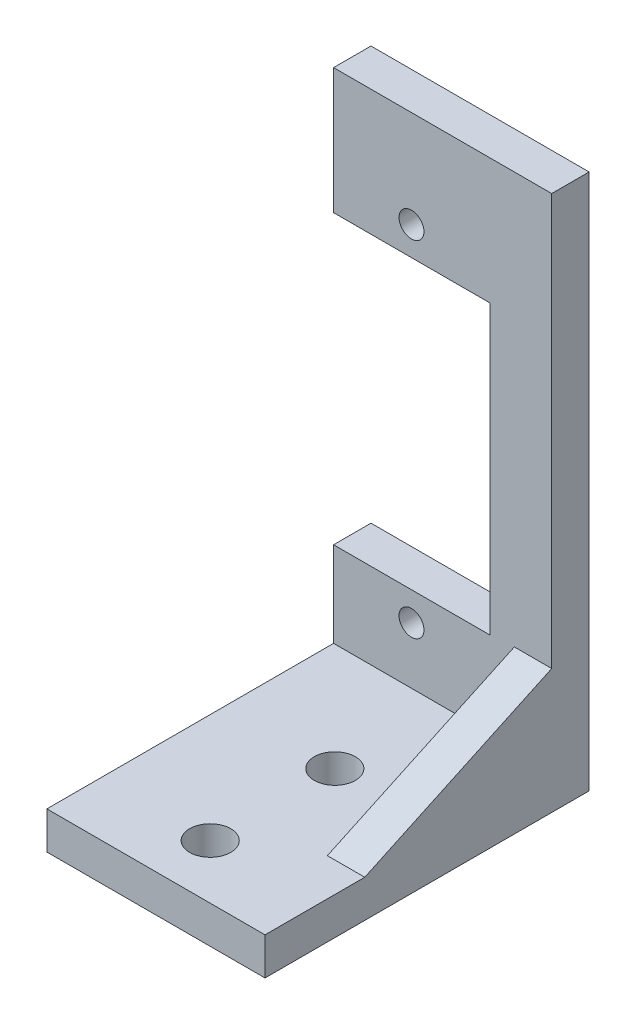
ISO-10303-21;
HEADER;
FILE_DESCRIPTION(('STEP AP214'),'2;1');
FILE_NAME('part.step','',(''),(''),'','','');
FILE_SCHEMA(('AUTOMOTIVE_DESIGN { 1 0 10303 214 1 1 1 1 }'));
ENDSEC;
DATA;
#1=APPLICATION_CONTEXT('core data for automotive mechanical design processes');
#2=APPLICATION_PROTOCOL_DEFINITION('international standard','automotive_design',2000,#1);
#3=PRODUCT_CONTEXT('',#1,'mechanical');
#4=PRODUCT('Part','Part','',(#3));
#5=PRODUCT_RELATED_PRODUCT_CATEGORY('part','',(#4));
#6=PRODUCT_DEFINITION_FORMATION('','',#4);
#7=PRODUCT_DEFINITION_CONTEXT('part definition',#1,'design');
#8=PRODUCT_DEFINITION('design','',#6,#7);
#9=PRODUCT_DEFINITION_SHAPE('','',#8);
#10=(LENGTH_UNIT() NAMED_UNIT(*) SI_UNIT(.MILLI.,.METRE.));
#11=(NAMED_UNIT(*) PLANE_ANGLE_UNIT() SI_UNIT($,.RADIAN.));
#12=(NAMED_UNIT(*) SI_UNIT($,.STERADIAN.) SOLID_ANGLE_UNIT());
#13=UNCERTAINTY_MEASURE_WITH_UNIT(LENGTH_MEASURE(1.E-05),#10,'distance_accuracy_value','');
#14=(GEOMETRIC_REPRESENTATION_CONTEXT(3) GLOBAL_UNCERTAINTY_ASSIGNED_CONTEXT((#13)) GLOBAL_UNIT_ASSIGNED_CONTEXT((#10,
#11,#12)) REPRESENTATION_CONTEXT('',''));
#15=CARTESIAN_POINT('',(0.,0.,0.));
#16=DIRECTION('',(0.,0.,1.));
#17=DIRECTION('',(1.,0.,0.));
#18=AXIS2_PLACEMENT_3D('',#15,#16,#17);
#19=CARTESIAN_POINT('',(-8.75,3.,11.5));
#20=DIRECTION('',(1.,0.,0.));
#21=DIRECTION('',(0.,0.,-1.));
#22=AXIS2_PLACEMENT_3D('',#19,#20,#21);
#23=PLANE('',#22);
#24=DIRECTION('',(0.,-1.,0.));
#25=VECTOR('',#24,1.);
#26=CARTESIAN_POINT('',(-8.75,43.,-11.5));
#27=LINE('',#26,#25);
#28=CARTESIAN_POINT('',(-8.75,9.85,-11.5));
#29=VERTEX_POINT('',#28);
#30=CARTESIAN_POINT('',(-8.75,3.,-11.5));
#31=VERTEX_POINT('',#30);
#32=EDGE_CURVE('E243',#29,#31,#27,.T.);
#33=ORIENTED_EDGE('',*,*,#32,.F.);
#34=DIRECTION('',(0.,0.,-1.));
#35=VECTOR('',#34,1.);
#36=CARTESIAN_POINT('',(-8.75,9.85,14.7626617082123));
#37=LINE('',#36,#35);
#38=CARTESIAN_POINT('',(-8.75,9.85,-14.5));
#39=VERTEX_POINT('',#38);
#40=EDGE_CURVE('E190',#29,#39,#37,.T.);
#41=ORIENTED_EDGE('',*,*,#40,.T.);
#42=DIRECTION('',(0.,-1.,0.));
#43=VECTOR('',#42,1.);
#44=CARTESIAN_POINT('',(-8.75,43.,-14.5));
#45=LINE('',#44,#43);
#46=CARTESIAN_POINT('',(-8.75,0.,-14.5));
#47=VERTEX_POINT('',#46);
#48=EDGE_CURVE('E228',#39,#47,#45,.T.);
#49=ORIENTED_EDGE('',*,*,#48,.T.);
#50=DIRECTION('',(0.,0.,1.));
#51=VECTOR('',#50,1.);
#52=CARTESIAN_POINT('',(-8.75,0.,11.5));
#53=LINE('',#52,#51);
#54=CARTESIAN_POINT('',(-8.75,0.,11.5));
#55=VERTEX_POINT('',#54);
#56=EDGE_CURVE('E261',#47,#55,#53,.T.);
#57=ORIENTED_EDGE('',*,*,#56,.T.);
#58=DIRECTION('',(0.,-1.,0.));
#59=VECTOR('',#58,1.);
#60=CARTESIAN_POINT('',(-8.75,3.,11.5));
#61=LINE('',#60,#59);
#62=CARTESIAN_POINT('',(-8.75,3.,11.5));
#63=VERTEX_POINT('',#62);
#64=EDGE_CURVE('E11',#63,#55,#61,.T.);
#65=ORIENTED_EDGE('',*,*,#64,.F.);
#66=DIRECTION('',(0.,0.,1.));
#67=VECTOR('',#66,1.);
#68=CARTESIAN_POINT('',(-8.75,3.,11.5));
#69=LINE('',#68,#67);
#70=EDGE_CURVE('E265',#31,#63,#69,.T.);
#71=ORIENTED_EDGE('',*,*,#70,.F.);
#72=EDGE_LOOP('',(#33,#41,#49,#57,#65,#71));
#73=FACE_BOUND('',#72,.T.);
#74=ADVANCED_FACE('F39',(#73),#23,.F.);
#75=CARTESIAN_POINT('',(0.,3.,0.));
#76=DIRECTION('',(0.,1.,0.));
#77=DIRECTION('',(0.,0.,1.));
#78=AXIS2_PLACEMENT_3D('',#75,#76,#77);
#79=PLANE('',#78);
#80=DIRECTION('',(1.,0.,0.));
#81=VECTOR('',#80,1.);
#82=CARTESIAN_POINT('',(5.75,3.,3.5));
#83=LINE('',#82,#81);
#84=CARTESIAN_POINT('',(5.75,3.,3.5));
#85=VERTEX_POINT('',#84);
#86=CARTESIAN_POINT('',(8.75,3.,3.5));
#87=VERTEX_POINT('',#86);
#88=EDGE_CURVE('E148',#85,#87,#83,.T.);
#89=ORIENTED_EDGE('',*,*,#88,.F.);
#90=DIRECTION('',(0.,0.,-1.));
#91=VECTOR('',#90,1.);
#92=CARTESIAN_POINT('',(5.75,3.,-11.5));
#93=LINE('',#92,#91);
#94=CARTESIAN_POINT('',(5.75,3.,-11.5));
#95=VERTEX_POINT('',#94);
#96=EDGE_CURVE('E149',#85,#95,#93,.T.);
#97=ORIENTED_EDGE('',*,*,#96,.T.);
#98=DIRECTION('',(-1.,0.,0.));
#99=VECTOR('',#98,1.);
#100=CARTESIAN_POINT('',(8.75,3.,-11.5));
#101=LINE('',#100,#99);
#102=EDGE_CURVE('E64',#95,#31,#101,.T.);
#103=ORIENTED_EDGE('',*,*,#102,.T.);
#104=ORIENTED_EDGE('',*,*,#70,.T.);
#105=DIRECTION('',(1.,0.,0.));
#106=VECTOR('',#105,1.);
#107=CARTESIAN_POINT('',(8.75,3.,11.5));
#108=LINE('',#107,#106);
#109=CARTESIAN_POINT('',(8.75,3.,11.5));
#110=VERTEX_POINT('',#109);
#111=EDGE_CURVE('E81',#63,#110,#108,.T.);
#112=ORIENTED_EDGE('',*,*,#111,.T.);
#113=DIRECTION('',(0.,0.,-1.));
#114=VECTOR('',#113,1.);
#115=CARTESIAN_POINT('',(8.75,3.,11.5));
#116=LINE('',#115,#114);
#117=EDGE_CURVE('E271',#110,#87,#116,.T.);
#118=ORIENTED_EDGE('',*,*,#117,.T.);
#119=EDGE_LOOP('',(#89,#97,#103,#104,#112,#118));
#120=FACE_BOUND('',#119,.T.);
#121=CARTESIAN_POINT('',(0.,3.,-2.85));
#122=DIRECTION('',(0.,1.,0.));
#123=DIRECTION('',(0.,0.,1.));
#124=AXIS2_PLACEMENT_3D('',#121,#122,#123);
#125=CIRCLE('',#124,1.65);
#126=CARTESIAN_POINT('',(0.,3.,-1.2));
#127=VERTEX_POINT('',#126);
#128=EDGE_CURVE('E257',#127,#127,#125,.T.);
#129=ORIENTED_EDGE('',*,*,#128,.F.);
#130=EDGE_LOOP('',(#129));
#131=FACE_BOUND('',#130,.T.);
#132=CARTESIAN_POINT('',(0.,3.,7.15));
#133=DIRECTION('',(0.,1.,0.));
#134=DIRECTION('',(0.,0.,1.));
#135=AXIS2_PLACEMENT_3D('',#132,#133,#134);
#136=CIRCLE('',#135,1.65);
#137=CARTESIAN_POINT('',(0.,3.,8.8));
#138=VERTEX_POINT('',#137);
#139=EDGE_CURVE('E249',#138,#138,#136,.T.);
#140=ORIENTED_EDGE('',*,*,#139,.F.);
#141=EDGE_LOOP('',(#140));
#142=FACE_BOUND('',#141,.T.);
#143=ADVANCED_FACE('F331',(#120,#131,#142),#79,.T.);
#144=CARTESIAN_POINT('',(0.,0.,0.));
#145=DIRECTION('',(0.,1.,0.));
#146=DIRECTION('',(0.,0.,1.));
#147=AXIS2_PLACEMENT_3D('',#144,#145,#146);
#148=PLANE('',#147);
#149=ORIENTED_EDGE('',*,*,#56,.F.);
#150=DIRECTION('',(-1.,0.,0.));
#151=VECTOR('',#150,1.);
#152=CARTESIAN_POINT('',(-8.75,0.,-14.5));
#153=LINE('',#152,#151);
#154=CARTESIAN_POINT('',(8.75,0.,-14.5));
#155=VERTEX_POINT('',#154);
#156=EDGE_CURVE('E177',#155,#47,#153,.T.);
#157=ORIENTED_EDGE('',*,*,#156,.F.);
#158=DIRECTION('',(0.,0.,-1.));
#159=VECTOR('',#158,1.);
#160=CARTESIAN_POINT('',(8.75,0.,11.5));
#161=LINE('',#160,#159);
#162=CARTESIAN_POINT('',(8.75,0.,11.5));
#163=VERTEX_POINT('',#162);
#164=EDGE_CURVE('E268',#163,#155,#161,.T.);
#165=ORIENTED_EDGE('',*,*,#164,.F.);
#166=DIRECTION('',(1.,0.,0.));
#167=VECTOR('',#166,1.);
#168=CARTESIAN_POINT('',(8.75,0.,11.5));
#169=LINE('',#168,#167);
#170=EDGE_CURVE('E78',#55,#163,#169,.T.);
#171=ORIENTED_EDGE('',*,*,#170,.F.);
#172=EDGE_LOOP('',(#149,#157,#165,#171));
#173=FACE_BOUND('',#172,.T.);
#174=CARTESIAN_POINT('',(0.,0.,-2.85));
#175=DIRECTION('',(0.,1.,0.));
#176=DIRECTION('',(0.,0.,1.));
#177=AXIS2_PLACEMENT_3D('',#174,#175,#176);
#178=CIRCLE('',#177,1.65);
#179=CARTESIAN_POINT('',(0.,0.,-1.2));
#180=VERTEX_POINT('',#179);
#181=EDGE_CURVE('E253',#180,#180,#178,.T.);
#182=ORIENTED_EDGE('',*,*,#181,.T.);
#183=EDGE_LOOP('',(#182));
#184=FACE_BOUND('',#183,.T.);
#185=CARTESIAN_POINT('',(0.,0.,7.15));
#186=DIRECTION('',(0.,1.,0.));
#187=DIRECTION('',(0.,0.,1.));
#188=AXIS2_PLACEMENT_3D('',#185,#186,#187);
#189=CIRCLE('',#188,1.65);
#190=CARTESIAN_POINT('',(0.,0.,8.8));
#191=VERTEX_POINT('',#190);
#192=EDGE_CURVE('E248',#191,#191,#189,.T.);
#193=ORIENTED_EDGE('',*,*,#192,.T.);
#194=EDGE_LOOP('',(#193));
#195=FACE_BOUND('',#194,.T.);
#196=ADVANCED_FACE('F292',(#173,#184,#195),#148,.F.);
#197=CARTESIAN_POINT('',(-8.75,43.,-14.5));
#198=VERTEX_POINT('',#197);
#199=CARTESIAN_POINT('',(-8.75,32.92,-14.5));
#200=VERTEX_POINT('',#199);
#201=EDGE_CURVE('E232',#198,#200,#45,.T.);
#202=ORIENTED_EDGE('',*,*,#201,.T.);
#203=DIRECTION('',(0.,0.,-1.));
#204=VECTOR('',#203,1.);
#205=CARTESIAN_POINT('',(-8.75,32.92,14.7626617082123));
#206=LINE('',#205,#204);
#207=CARTESIAN_POINT('',(-8.75,32.92,-11.5));
#208=VERTEX_POINT('',#207);
#209=EDGE_CURVE('E55',#208,#200,#206,.T.);
#210=ORIENTED_EDGE('',*,*,#209,.F.);
#211=CARTESIAN_POINT('',(-8.75,43.,-11.5));
#212=VERTEX_POINT('',#211);
#213=EDGE_CURVE('E244',#212,#208,#27,.T.);
#214=ORIENTED_EDGE('',*,*,#213,.F.);
#215=DIRECTION('',(0.,0.,1.));
#216=VECTOR('',#215,1.);
#217=CARTESIAN_POINT('',(-8.75,43.,-11.5));
#218=LINE('',#217,#216);
#219=EDGE_CURVE('E215',#198,#212,#218,.T.);
#220=ORIENTED_EDGE('',*,*,#219,.F.);
#221=EDGE_LOOP('',(#202,#210,#214,#220));
#222=FACE_BOUND('',#221,.T.);
#223=ADVANCED_FACE('F41',(#222),#23,.F.);
#224=CARTESIAN_POINT('',(8.75,3.,11.5));
#225=DIRECTION('',(0.,0.,-1.));
#226=DIRECTION('',(-1.,0.,0.));
#227=AXIS2_PLACEMENT_3D('',#224,#225,#226);
#228=PLANE('',#227);
#229=ORIENTED_EDGE('',*,*,#170,.T.);
#230=DIRECTION('',(0.,-1.,0.));
#231=VECTOR('',#230,1.);
#232=CARTESIAN_POINT('',(8.75,3.,11.5));
#233=LINE('',#232,#231);
#234=EDGE_CURVE('E48',#110,#163,#233,.T.);
#235=ORIENTED_EDGE('',*,*,#234,.F.);
#236=ORIENTED_EDGE('',*,*,#111,.F.);
#237=ORIENTED_EDGE('',*,*,#64,.T.);
#238=EDGE_LOOP('',(#229,#235,#236,#237));
#239=FACE_BOUND('',#238,.T.);
#240=ADVANCED_FACE('F322',(#239),#228,.F.);
#241=CARTESIAN_POINT('',(8.75,3.,11.5));
#242=DIRECTION('',(-1.,0.,0.));
#243=DIRECTION('',(0.,0.,1.));
#244=AXIS2_PLACEMENT_3D('',#241,#242,#243);
#245=PLANE('',#244);
#246=ORIENTED_EDGE('',*,*,#164,.T.);
#247=DIRECTION('',(0.,-1.,0.));
#248=VECTOR('',#247,1.);
#249=CARTESIAN_POINT('',(8.75,43.,-14.5));
#250=LINE('',#249,#248);
#251=CARTESIAN_POINT('',(8.75,43.,-14.5));
#252=VERTEX_POINT('',#251);
#253=EDGE_CURVE('E236',#252,#155,#250,.T.);
#254=ORIENTED_EDGE('',*,*,#253,.F.);
#255=DIRECTION('',(0.,0.,-1.));
#256=VECTOR('',#255,1.);
#257=CARTESIAN_POINT('',(8.75,43.,-11.5));
#258=LINE('',#257,#256);
#259=CARTESIAN_POINT('',(8.75,43.,-11.5));
#260=VERTEX_POINT('',#259);
#261=EDGE_CURVE('E222',#260,#252,#258,.T.);
#262=ORIENTED_EDGE('',*,*,#261,.F.);
#263=DIRECTION('',(0.,-1.,0.));
#264=VECTOR('',#263,1.);
#265=CARTESIAN_POINT('',(8.75,43.,-11.5));
#266=LINE('',#265,#264);
#267=CARTESIAN_POINT('',(8.75,10.,-11.5));
#268=VERTEX_POINT('',#267);
#269=EDGE_CURVE('E240',#260,#268,#266,.T.);
#270=ORIENTED_EDGE('',*,*,#269,.T.);
#271=DIRECTION('',(0.,-0.422885465331124,0.906183139995265));
#272=VECTOR('',#271,1.);
#273=CARTESIAN_POINT('',(8.75,3.,3.5));
#274=LINE('',#273,#272);
#275=EDGE_CURVE('E142',#268,#87,#274,.T.);
#276=ORIENTED_EDGE('',*,*,#275,.T.);
#277=ORIENTED_EDGE('',*,*,#117,.F.);
#278=ORIENTED_EDGE('',*,*,#234,.T.);
#279=EDGE_LOOP('',(#246,#254,#262,#270,#276,#277,#278));
#280=FACE_BOUND('',#279,.T.);
#281=ADVANCED_FACE('F287',(#280),#245,.F.);
#282=CARTESIAN_POINT('',(0.,3.,-2.85));
#283=DIRECTION('',(0.,-1.,0.));
#284=DIRECTION('',(0.,0.,-1.));
#285=AXIS2_PLACEMENT_3D('',#282,#283,#284);
#286=CYLINDRICAL_SURFACE('',#285,1.65);
#287=ORIENTED_EDGE('',*,*,#128,.T.);
#288=EDGE_LOOP('',(#287));
#289=FACE_BOUND('',#288,.T.);
#290=ORIENTED_EDGE('',*,*,#181,.F.);
#291=EDGE_LOOP('',(#290));
#292=FACE_BOUND('',#291,.T.);
#293=ADVANCED_FACE('F328',(#289,#292),#286,.F.);
#294=CARTESIAN_POINT('',(0.,3.,7.15));
#295=DIRECTION('',(0.,-1.,0.));
#296=DIRECTION('',(0.,0.,-1.));
#297=AXIS2_PLACEMENT_3D('',#294,#295,#296);
#298=CYLINDRICAL_SURFACE('',#297,1.65);
#299=ORIENTED_EDGE('',*,*,#139,.T.);
#300=EDGE_LOOP('',(#299));
#301=FACE_BOUND('',#300,.T.);
#302=ORIENTED_EDGE('',*,*,#192,.F.);
#303=EDGE_LOOP('',(#302));
#304=FACE_BOUND('',#303,.T.);
#305=ADVANCED_FACE('F344',(#301,#304),#298,.F.);
#306=CARTESIAN_POINT('',(-8.75,43.,-11.5));
#307=DIRECTION('',(0.,0.,-1.));
#308=DIRECTION('',(-1.,0.,0.));
#309=AXIS2_PLACEMENT_3D('',#306,#307,#308);
#310=PLANE('',#309);
#311=CARTESIAN_POINT('',(-2.5,7.55,-11.5));
#312=DIRECTION('',(0.,0.,-1.));
#313=DIRECTION('',(-1.,0.,0.));
#314=AXIS2_PLACEMENT_3D('',#311,#312,#313);
#315=CIRCLE('',#314,1.);
#316=CARTESIAN_POINT('',(-3.5,7.55,-11.5));
#317=VERTEX_POINT('',#316);
#318=EDGE_CURVE('E172',#317,#317,#315,.F.);
#319=ORIENTED_EDGE('',*,*,#318,.F.);
#320=EDGE_LOOP('',(#319));
#321=FACE_BOUND('',#320,.T.);
#322=CARTESIAN_POINT('',(-2.5,35.22,-11.5));
#323=DIRECTION('',(0.,0.,-1.));
#324=DIRECTION('',(-1.,0.,0.));
#325=AXIS2_PLACEMENT_3D('',#322,#323,#324);
#326=CIRCLE('',#325,1.);
#327=CARTESIAN_POINT('',(-3.5,35.22,-11.5));
#328=VERTEX_POINT('',#327);
#329=EDGE_CURVE('E173',#328,#328,#326,.F.);
#330=ORIENTED_EDGE('',*,*,#329,.F.);
#331=EDGE_LOOP('',(#330));
#332=FACE_BOUND('',#331,.T.);
#333=DIRECTION('',(0.,1.,0.));
#334=VECTOR('',#333,1.);
#335=CARTESIAN_POINT('',(5.75,10.,-11.5));
#336=LINE('',#335,#334);
#337=CARTESIAN_POINT('',(5.75,10.,-11.5));
#338=VERTEX_POINT('',#337);
#339=EDGE_CURVE('E153',#95,#338,#336,.T.);
#340=ORIENTED_EDGE('',*,*,#339,.T.);
#341=DIRECTION('',(1.,0.,0.));
#342=VECTOR('',#341,1.);
#343=CARTESIAN_POINT('',(5.75,10.,-11.5));
#344=LINE('',#343,#342);
#345=EDGE_CURVE('E136',#338,#268,#344,.T.);
#346=ORIENTED_EDGE('',*,*,#345,.T.);
#347=ORIENTED_EDGE('',*,*,#269,.F.);
#348=DIRECTION('',(1.,0.,0.));
#349=VECTOR('',#348,1.);
#350=CARTESIAN_POINT('',(-8.75,43.,-11.5));
#351=LINE('',#350,#349);
#352=EDGE_CURVE('E219',#212,#260,#351,.T.);
#353=ORIENTED_EDGE('',*,*,#352,.F.);
#354=ORIENTED_EDGE('',*,*,#213,.T.);
#355=DIRECTION('',(-1.,0.,0.));
#356=VECTOR('',#355,1.);
#357=CARTESIAN_POINT('',(-8.75,32.92,-11.5));
#358=LINE('',#357,#356);
#359=CARTESIAN_POINT('',(3.8,32.92,-11.5));
#360=VERTEX_POINT('',#359);
#361=EDGE_CURVE('E182',#360,#208,#358,.T.);
#362=ORIENTED_EDGE('',*,*,#361,.F.);
#363=DIRECTION('',(0.,1.,0.));
#364=VECTOR('',#363,1.);
#365=CARTESIAN_POINT('',(3.8,9.85,-11.5));
#366=LINE('',#365,#364);
#367=CARTESIAN_POINT('',(3.8,9.85,-11.5));
#368=VERTEX_POINT('',#367);
#369=EDGE_CURVE('E186',#368,#360,#366,.T.);
#370=ORIENTED_EDGE('',*,*,#369,.F.);
#371=DIRECTION('',(1.,0.,0.));
#372=VECTOR('',#371,1.);
#373=CARTESIAN_POINT('',(-8.75,9.85,-11.5));
#374=LINE('',#373,#372);
#375=EDGE_CURVE('E189',#29,#368,#374,.T.);
#376=ORIENTED_EDGE('',*,*,#375,.F.);
#377=ORIENTED_EDGE('',*,*,#32,.T.);
#378=ORIENTED_EDGE('',*,*,#102,.F.);
#379=EDGE_LOOP('',(#340,#346,#347,#353,#354,#362,#370,#376,#377,#378));
#380=FACE_BOUND('',#379,.T.);
#381=ADVANCED_FACE('F157',(#321,#332,#380),#310,.F.);
#382=CARTESIAN_POINT('',(-8.75,43.,-14.5));
#383=DIRECTION('',(0.,0.,1.));
#384=DIRECTION('',(1.,0.,0.));
#385=AXIS2_PLACEMENT_3D('',#382,#383,#384);
#386=PLANE('',#385);
#387=CARTESIAN_POINT('',(-2.5,7.55,-14.5));
#388=DIRECTION('',(0.,0.,-1.));
#389=DIRECTION('',(-1.,0.,0.));
#390=AXIS2_PLACEMENT_3D('',#387,#388,#389);
#391=CIRCLE('',#390,1.);
#392=CARTESIAN_POINT('',(-3.5,7.55,-14.5));
#393=VERTEX_POINT('',#392);
#394=EDGE_CURVE('E168',#393,#393,#391,.T.);
#395=ORIENTED_EDGE('',*,*,#394,.F.);
#396=EDGE_LOOP('',(#395));
#397=FACE_BOUND('',#396,.T.);
#398=CARTESIAN_POINT('',(-2.5,35.22,-14.5));
#399=DIRECTION('',(0.,0.,-1.));
#400=DIRECTION('',(-1.,0.,0.));
#401=AXIS2_PLACEMENT_3D('',#398,#399,#400);
#402=CIRCLE('',#401,1.);
#403=CARTESIAN_POINT('',(-3.5,35.22,-14.5));
#404=VERTEX_POINT('',#403);
#405=EDGE_CURVE('E178',#404,#404,#402,.T.);
#406=ORIENTED_EDGE('',*,*,#405,.F.);
#407=EDGE_LOOP('',(#406));
#408=FACE_BOUND('',#407,.T.);
#409=ORIENTED_EDGE('',*,*,#48,.F.);
#410=DIRECTION('',(-1.,0.,0.));
#411=VECTOR('',#410,1.);
#412=CARTESIAN_POINT('',(-8.75,9.85,-14.5));
#413=LINE('',#412,#411);
#414=CARTESIAN_POINT('',(3.8,9.85,-14.5));
#415=VERTEX_POINT('',#414);
#416=EDGE_CURVE('E199',#415,#39,#413,.T.);
#417=ORIENTED_EDGE('',*,*,#416,.F.);
#418=DIRECTION('',(0.,-1.,0.));
#419=VECTOR('',#418,1.);
#420=CARTESIAN_POINT('',(3.8,9.85,-14.5));
#421=LINE('',#420,#419);
#422=CARTESIAN_POINT('',(3.8,32.92,-14.5));
#423=VERTEX_POINT('',#422);
#424=EDGE_CURVE('E195',#423,#415,#421,.T.);
#425=ORIENTED_EDGE('',*,*,#424,.F.);
#426=DIRECTION('',(1.,0.,0.));
#427=VECTOR('',#426,1.);
#428=CARTESIAN_POINT('',(-8.75,32.92,-14.5));
#429=LINE('',#428,#427);
#430=EDGE_CURVE('E166',#200,#423,#429,.T.);
#431=ORIENTED_EDGE('',*,*,#430,.F.);
#432=ORIENTED_EDGE('',*,*,#201,.F.);
#433=DIRECTION('',(-1.,0.,0.));
#434=VECTOR('',#433,1.);
#435=CARTESIAN_POINT('',(-8.75,43.,-14.5));
#436=LINE('',#435,#434);
#437=EDGE_CURVE('E225',#252,#198,#436,.T.);
#438=ORIENTED_EDGE('',*,*,#437,.F.);
#439=ORIENTED_EDGE('',*,*,#253,.T.);
#440=ORIENTED_EDGE('',*,*,#156,.T.);
#441=EDGE_LOOP('',(#409,#417,#425,#431,#432,#438,#439,#440));
#442=FACE_BOUND('',#441,.T.);
#443=ADVANCED_FACE('F296',(#397,#408,#442),#386,.F.);
#444=CARTESIAN_POINT('',(0.,43.,0.));
#445=DIRECTION('',(0.,-1.,0.));
#446=DIRECTION('',(0.,0.,-1.));
#447=AXIS2_PLACEMENT_3D('',#444,#445,#446);
#448=PLANE('',#447);
#449=ORIENTED_EDGE('',*,*,#219,.T.);
#450=ORIENTED_EDGE('',*,*,#352,.T.);
#451=ORIENTED_EDGE('',*,*,#261,.T.);
#452=ORIENTED_EDGE('',*,*,#437,.T.);
#453=EDGE_LOOP('',(#449,#450,#451,#452));
#454=FACE_BOUND('',#453,.T.);
#455=ADVANCED_FACE('F302',(#454),#448,.F.);
#456=CARTESIAN_POINT('',(-8.75,9.85,14.7626617082123));
#457=DIRECTION('',(0.,-1.,0.));
#458=DIRECTION('',(1.,0.,0.));
#459=AXIS2_PLACEMENT_3D('',#456,#457,#458);
#460=PLANE('',#459);
#461=ORIENTED_EDGE('',*,*,#375,.T.);
#462=DIRECTION('',(0.,0.,-1.));
#463=VECTOR('',#462,1.);
#464=CARTESIAN_POINT('',(3.8,9.85,14.7626617082123));
#465=LINE('',#464,#463);
#466=EDGE_CURVE('E205',#368,#415,#465,.T.);
#467=ORIENTED_EDGE('',*,*,#466,.T.);
#468=ORIENTED_EDGE('',*,*,#416,.T.);
#469=ORIENTED_EDGE('',*,*,#40,.F.);
#470=EDGE_LOOP('',(#461,#467,#468,#469));
#471=FACE_BOUND('',#470,.T.);
#472=ADVANCED_FACE('F357',(#471),#460,.F.);
#473=CARTESIAN_POINT('',(3.8,9.85,14.7626617082123));
#474=DIRECTION('',(1.,0.,0.));
#475=DIRECTION('',(0.,0.,-1.));
#476=AXIS2_PLACEMENT_3D('',#473,#474,#475);
#477=PLANE('',#476);
#478=ORIENTED_EDGE('',*,*,#369,.T.);
#479=DIRECTION('',(0.,0.,-1.));
#480=VECTOR('',#479,1.);
#481=CARTESIAN_POINT('',(3.8,32.92,14.7626617082123));
#482=LINE('',#481,#480);
#483=EDGE_CURVE('E208',#360,#423,#482,.T.);
#484=ORIENTED_EDGE('',*,*,#483,.T.);
#485=ORIENTED_EDGE('',*,*,#424,.T.);
#486=ORIENTED_EDGE('',*,*,#466,.F.);
#487=EDGE_LOOP('',(#478,#484,#485,#486));
#488=FACE_BOUND('',#487,.T.);
#489=ADVANCED_FACE('F312',(#488),#477,.F.);
#490=CARTESIAN_POINT('',(-8.75,32.92,14.7626617082123));
#491=DIRECTION('',(0.,1.,0.));
#492=DIRECTION('',(0.,0.,1.));
#493=AXIS2_PLACEMENT_3D('',#490,#491,#492);
#494=PLANE('',#493);
#495=ORIENTED_EDGE('',*,*,#361,.T.);
#496=ORIENTED_EDGE('',*,*,#209,.T.);
#497=ORIENTED_EDGE('',*,*,#430,.T.);
#498=ORIENTED_EDGE('',*,*,#483,.F.);
#499=EDGE_LOOP('',(#495,#496,#497,#498));
#500=FACE_BOUND('',#499,.T.);
#501=ADVANCED_FACE('F310',(#500),#494,.F.);
#502=CARTESIAN_POINT('',(-2.5,35.22,14.7626617082123));
#503=DIRECTION('',(0.,0.,-1.));
#504=DIRECTION('',(-1.,0.,0.));
#505=AXIS2_PLACEMENT_3D('',#502,#503,#504);
#506=CYLINDRICAL_SURFACE('',#505,1.);
#507=ORIENTED_EDGE('',*,*,#329,.T.);
#508=EDGE_LOOP('',(#507));
#509=FACE_BOUND('',#508,.T.);
#510=ORIENTED_EDGE('',*,*,#405,.T.);
#511=EDGE_LOOP('',(#510));
#512=FACE_BOUND('',#511,.T.);
#513=ADVANCED_FACE('F360',(#509,#512),#506,.F.);
#514=CARTESIAN_POINT('',(-2.5,7.55,14.7626617082123));
#515=DIRECTION('',(0.,0.,-1.));
#516=DIRECTION('',(-1.,0.,0.));
#517=AXIS2_PLACEMENT_3D('',#514,#515,#516);
#518=CYLINDRICAL_SURFACE('',#517,1.);
#519=ORIENTED_EDGE('',*,*,#318,.T.);
#520=EDGE_LOOP('',(#519));
#521=FACE_BOUND('',#520,.T.);
#522=ORIENTED_EDGE('',*,*,#394,.T.);
#523=EDGE_LOOP('',(#522));
#524=FACE_BOUND('',#523,.T.);
#525=ADVANCED_FACE('F367',(#521,#524),#518,.F.);
#526=CARTESIAN_POINT('',(5.75,3.,3.5));
#527=DIRECTION('',(0.,0.906183139995265,0.422885465331124));
#528=DIRECTION('',(0.,-0.422885465331124,0.906183139995265));
#529=AXIS2_PLACEMENT_3D('',#526,#527,#528);
#530=PLANE('',#529);
#531=ORIENTED_EDGE('',*,*,#275,.F.);
#532=ORIENTED_EDGE('',*,*,#345,.F.);
#533=DIRECTION('',(0.,-0.422885465331124,0.906183139995265));
#534=VECTOR('',#533,1.);
#535=CARTESIAN_POINT('',(5.75,3.,3.5));
#536=LINE('',#535,#534);
#537=EDGE_CURVE('E139',#338,#85,#536,.T.);
#538=ORIENTED_EDGE('',*,*,#537,.T.);
#539=ORIENTED_EDGE('',*,*,#88,.T.);
#540=EDGE_LOOP('',(#531,#532,#538,#539));
#541=FACE_BOUND('',#540,.T.);
#542=ADVANCED_FACE('F138',(#541),#530,.T.);
#543=CARTESIAN_POINT('',(5.75,0.,0.));
#544=DIRECTION('',(-1.,0.,0.));
#545=DIRECTION('',(0.,0.,1.));
#546=AXIS2_PLACEMENT_3D('',#543,#544,#545);
#547=PLANE('',#546);
#548=ORIENTED_EDGE('',*,*,#339,.F.);
#549=ORIENTED_EDGE('',*,*,#96,.F.);
#550=ORIENTED_EDGE('',*,*,#537,.F.);
#551=EDGE_LOOP('',(#548,#549,#550));
#552=FACE_BOUND('',#551,.T.);
#553=ADVANCED_FACE('F152',(#552),#547,.T.);
#554=CLOSED_SHELL('',(#74,#143,#196,#223,#240,#281,#293,#305,#381,#443,#455,#472,#489,#501,#513,
#525,#542,#553));
#555=MANIFOLD_SOLID_BREP('B2',#554);
#556=ADVANCED_BREP_SHAPE_REPRESENTATION('',(#18,#555),#14);
#557=SHAPE_DEFINITION_REPRESENTATION(#9,#556);
ENDSEC;
END-ISO-10303-21;
